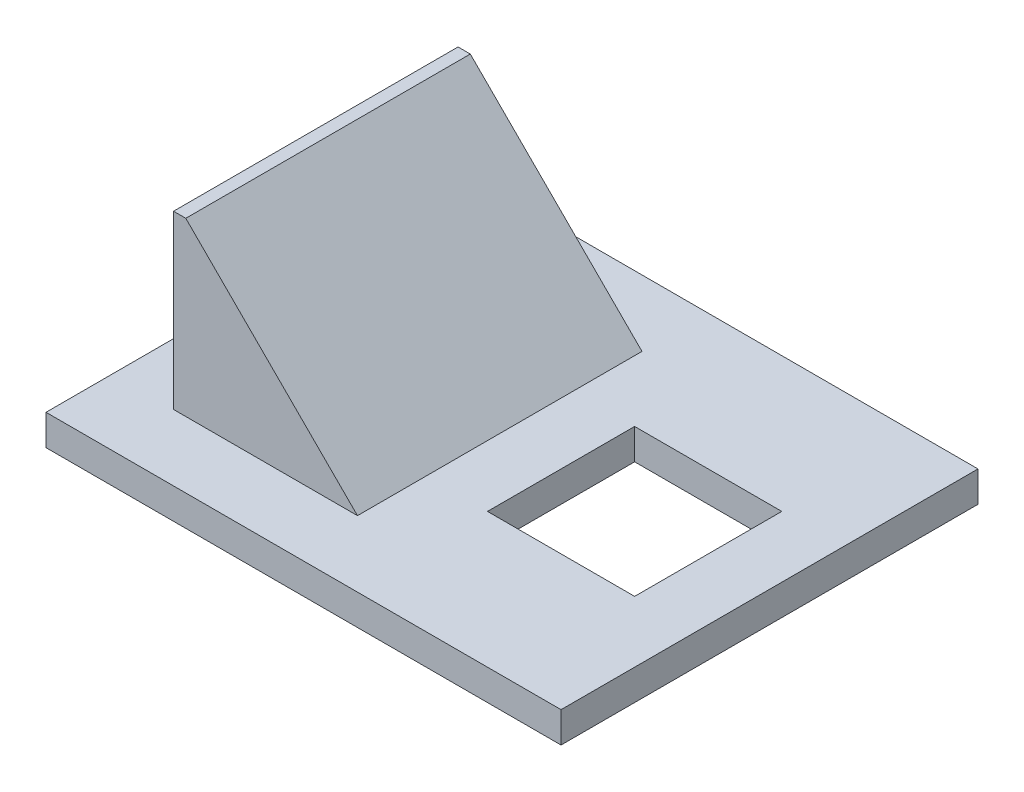
ISO-10303-21;
HEADER;
FILE_DESCRIPTION(('STEP AP214'),'2;1');
FILE_NAME('part.step','',(''),(''),'','','');
FILE_SCHEMA(('AUTOMOTIVE_DESIGN { 1 0 10303 214 1 1 1 1 }'));
ENDSEC;
DATA;
#1=APPLICATION_CONTEXT('core data for automotive mechanical design processes');
#2=APPLICATION_PROTOCOL_DEFINITION('international standard','automotive_design',2000,#1);
#3=PRODUCT_CONTEXT('',#1,'mechanical');
#4=PRODUCT('Part','Part','',(#3));
#5=PRODUCT_RELATED_PRODUCT_CATEGORY('part','',(#4));
#6=PRODUCT_DEFINITION_FORMATION('','',#4);
#7=PRODUCT_DEFINITION_CONTEXT('part definition',#1,'design');
#8=PRODUCT_DEFINITION('design','',#6,#7);
#9=PRODUCT_DEFINITION_SHAPE('','',#8);
#10=(LENGTH_UNIT() NAMED_UNIT(*) SI_UNIT(.MILLI.,.METRE.));
#11=(NAMED_UNIT(*) PLANE_ANGLE_UNIT() SI_UNIT($,.RADIAN.));
#12=(NAMED_UNIT(*) SI_UNIT($,.STERADIAN.) SOLID_ANGLE_UNIT());
#13=UNCERTAINTY_MEASURE_WITH_UNIT(LENGTH_MEASURE(1.E-05),#10,'distance_accuracy_value','');
#14=(GEOMETRIC_REPRESENTATION_CONTEXT(3) GLOBAL_UNCERTAINTY_ASSIGNED_CONTEXT((#13)) GLOBAL_UNIT_ASSIGNED_CONTEXT((#10,
#11,#12)) REPRESENTATION_CONTEXT('',''));
#15=CARTESIAN_POINT('',(0.,0.,0.));
#16=DIRECTION('',(0.,0.,1.));
#17=DIRECTION('',(1.,0.,0.));
#18=AXIS2_PLACEMENT_3D('',#15,#16,#17);
#19=CARTESIAN_POINT('',(0.,12.5,0.));
#20=DIRECTION('',(0.,1.,0.));
#21=DIRECTION('',(0.,0.,1.));
#22=AXIS2_PLACEMENT_3D('',#19,#20,#21);
#23=PLANE('',#22);
#24=DIRECTION('',(0.,0.,1.));
#25=VECTOR('',#24,1.);
#26=CARTESIAN_POINT('',(20.,12.5,-30.));
#27=LINE('',#26,#25);
#28=CARTESIAN_POINT('',(20.,12.5,-30.));
#29=VERTEX_POINT('',#28);
#30=CARTESIAN_POINT('',(20.,12.5,30.));
#31=VERTEX_POINT('',#30);
#32=EDGE_CURVE('E258',#29,#31,#27,.T.);
#33=ORIENTED_EDGE('',*,*,#32,.F.);
#34=DIRECTION('',(-1.,0.,0.));
#35=VECTOR('',#34,1.);
#36=CARTESIAN_POINT('',(20.,12.5,-30.));
#37=LINE('',#36,#35);
#38=CARTESIAN_POINT('',(80.,12.5,-30.));
#39=VERTEX_POINT('',#38);
#40=EDGE_CURVE('E267',#39,#29,#37,.T.);
#41=ORIENTED_EDGE('',*,*,#40,.F.);
#42=DIRECTION('',(0.,0.,-1.));
#43=VECTOR('',#42,1.);
#44=CARTESIAN_POINT('',(80.,12.5,-30.));
#45=LINE('',#44,#43);
#46=CARTESIAN_POINT('',(80.,12.5,30.));
#47=VERTEX_POINT('',#46);
#48=EDGE_CURVE('E264',#47,#39,#45,.T.);
#49=ORIENTED_EDGE('',*,*,#48,.F.);
#50=DIRECTION('',(1.,0.,0.));
#51=VECTOR('',#50,1.);
#52=CARTESIAN_POINT('',(20.,12.5,30.));
#53=LINE('',#52,#51);
#54=EDGE_CURVE('E260',#31,#47,#53,.T.);
#55=ORIENTED_EDGE('',*,*,#54,.F.);
#56=EDGE_LOOP('',(#33,#41,#49,#55));
#57=FACE_BOUND('',#56,.T.);
#58=DIRECTION('',(0.,0.,1.));
#59=VECTOR('',#58,1.);
#60=CARTESIAN_POINT('',(-105.,12.5,-85.));
#61=LINE('',#60,#59);
#62=CARTESIAN_POINT('',(-105.,12.5,-85.));
#63=VERTEX_POINT('',#62);
#64=CARTESIAN_POINT('',(-105.,12.5,85.));
#65=VERTEX_POINT('',#64);
#66=EDGE_CURVE('E280',#63,#65,#61,.T.);
#67=ORIENTED_EDGE('',*,*,#66,.T.);
#68=DIRECTION('',(1.,0.,0.));
#69=VECTOR('',#68,1.);
#70=CARTESIAN_POINT('',(-105.,12.5,85.));
#71=LINE('',#70,#69);
#72=CARTESIAN_POINT('',(105.,12.5,85.));
#73=VERTEX_POINT('',#72);
#74=EDGE_CURVE('E283',#65,#73,#71,.T.);
#75=ORIENTED_EDGE('',*,*,#74,.T.);
#76=DIRECTION('',(0.,0.,-1.));
#77=VECTOR('',#76,1.);
#78=CARTESIAN_POINT('',(105.,12.5,-85.));
#79=LINE('',#78,#77);
#80=CARTESIAN_POINT('',(105.,12.5,-85.));
#81=VERTEX_POINT('',#80);
#82=EDGE_CURVE('E286',#73,#81,#79,.T.);
#83=ORIENTED_EDGE('',*,*,#82,.T.);
#84=DIRECTION('',(-1.,0.,0.));
#85=VECTOR('',#84,1.);
#86=CARTESIAN_POINT('',(-105.,12.5,-85.));
#87=LINE('',#86,#85);
#88=EDGE_CURVE('E288',#81,#63,#87,.T.);
#89=ORIENTED_EDGE('',*,*,#88,.T.);
#90=EDGE_LOOP('',(#67,#75,#83,#89));
#91=FACE_BOUND('',#90,.T.);
#92=DIRECTION('',(0.,0.,-1.));
#93=VECTOR('',#92,1.);
#94=CARTESIAN_POINT('',(-4.99999999999998,12.5,-55.));
#95=LINE('',#94,#93);
#96=CARTESIAN_POINT('',(-4.99999999999998,12.5,58.));
#97=VERTEX_POINT('',#96);
#98=CARTESIAN_POINT('',(-4.99999999999998,12.5,-58.));
#99=VERTEX_POINT('',#98);
#100=EDGE_CURVE('E53',#97,#99,#95,.T.);
#101=ORIENTED_EDGE('',*,*,#100,.F.);
#102=DIRECTION('',(1.,0.,0.));
#103=VECTOR('',#102,1.);
#104=CARTESIAN_POINT('',(-80.,12.5,58.));
#105=LINE('',#104,#103);
#106=CARTESIAN_POINT('',(-80.,12.5,58.));
#107=VERTEX_POINT('',#106);
#108=EDGE_CURVE('E57',#107,#97,#105,.T.);
#109=ORIENTED_EDGE('',*,*,#108,.F.);
#110=DIRECTION('',(0.,0.,1.));
#111=VECTOR('',#110,1.);
#112=CARTESIAN_POINT('',(-80.,12.5,55.));
#113=LINE('',#112,#111);
#114=CARTESIAN_POINT('',(-80.,12.5,55.));
#115=VERTEX_POINT('',#114);
#116=EDGE_CURVE('E184',#115,#107,#113,.T.);
#117=ORIENTED_EDGE('',*,*,#116,.F.);
#118=DIRECTION('',(0.,0.,-1.));
#119=VECTOR('',#118,1.);
#120=CARTESIAN_POINT('',(-80.,12.5,0.));
#121=LINE('',#120,#119);
#122=CARTESIAN_POINT('',(-80.,12.5,-55.));
#123=VERTEX_POINT('',#122);
#124=EDGE_CURVE('E261',#115,#123,#121,.T.);
#125=ORIENTED_EDGE('',*,*,#124,.T.);
#126=DIRECTION('',(0.,0.,-1.));
#127=VECTOR('',#126,1.);
#128=CARTESIAN_POINT('',(-80.,12.5,-55.));
#129=LINE('',#128,#127);
#130=CARTESIAN_POINT('',(-80.,12.5,-58.));
#131=VERTEX_POINT('',#130);
#132=EDGE_CURVE('E214',#123,#131,#129,.T.);
#133=ORIENTED_EDGE('',*,*,#132,.T.);
#134=DIRECTION('',(-1.,0.,0.));
#135=VECTOR('',#134,1.);
#136=CARTESIAN_POINT('',(-7.49999999999998,12.5,-58.));
#137=LINE('',#136,#135);
#138=EDGE_CURVE('E208',#99,#131,#137,.T.);
#139=ORIENTED_EDGE('',*,*,#138,.F.);
#140=EDGE_LOOP('',(#101,#109,#117,#125,#133,#139));
#141=FACE_BOUND('',#140,.T.);
#142=ADVANCED_FACE('F36',(#57,#91,#141),#23,.T.);
#143=CARTESIAN_POINT('',(0.,0.,0.));
#144=DIRECTION('',(0.,1.,0.));
#145=DIRECTION('',(0.,0.,1.));
#146=AXIS2_PLACEMENT_3D('',#143,#144,#145);
#147=PLANE('',#146);
#148=DIRECTION('',(0.,0.,1.));
#149=VECTOR('',#148,1.);
#150=CARTESIAN_POINT('',(-105.,0.,-85.));
#151=LINE('',#150,#149);
#152=CARTESIAN_POINT('',(-105.,0.,-85.));
#153=VERTEX_POINT('',#152);
#154=CARTESIAN_POINT('',(-105.,0.,85.));
#155=VERTEX_POINT('',#154);
#156=EDGE_CURVE('E273',#153,#155,#151,.T.);
#157=ORIENTED_EDGE('',*,*,#156,.F.);
#158=DIRECTION('',(-1.,0.,0.));
#159=VECTOR('',#158,1.);
#160=CARTESIAN_POINT('',(-105.,0.,-85.));
#161=LINE('',#160,#159);
#162=CARTESIAN_POINT('',(105.,0.,-85.));
#163=VERTEX_POINT('',#162);
#164=EDGE_CURVE('E284',#163,#153,#161,.T.);
#165=ORIENTED_EDGE('',*,*,#164,.F.);
#166=DIRECTION('',(0.,0.,-1.));
#167=VECTOR('',#166,1.);
#168=CARTESIAN_POINT('',(105.,0.,-85.));
#169=LINE('',#168,#167);
#170=CARTESIAN_POINT('',(105.,0.,85.));
#171=VERTEX_POINT('',#170);
#172=EDGE_CURVE('E295',#171,#163,#169,.T.);
#173=ORIENTED_EDGE('',*,*,#172,.F.);
#174=DIRECTION('',(1.,0.,0.));
#175=VECTOR('',#174,1.);
#176=CARTESIAN_POINT('',(-105.,0.,85.));
#177=LINE('',#176,#175);
#178=EDGE_CURVE('E293',#155,#171,#177,.T.);
#179=ORIENTED_EDGE('',*,*,#178,.F.);
#180=EDGE_LOOP('',(#157,#165,#173,#179));
#181=FACE_BOUND('',#180,.T.);
#182=DIRECTION('',(-1.,0.,0.));
#183=VECTOR('',#182,1.);
#184=CARTESIAN_POINT('',(0.,0.,-30.));
#185=LINE('',#184,#183);
#186=CARTESIAN_POINT('',(80.,0.,-30.));
#187=VERTEX_POINT('',#186);
#188=CARTESIAN_POINT('',(20.,0.,-30.));
#189=VERTEX_POINT('',#188);
#190=EDGE_CURVE('E45',#187,#189,#185,.T.);
#191=ORIENTED_EDGE('',*,*,#190,.T.);
#192=DIRECTION('',(0.,0.,1.));
#193=VECTOR('',#192,1.);
#194=CARTESIAN_POINT('',(20.,0.,0.));
#195=LINE('',#194,#193);
#196=CARTESIAN_POINT('',(20.,0.,30.));
#197=VERTEX_POINT('',#196);
#198=EDGE_CURVE('E12',#189,#197,#195,.T.);
#199=ORIENTED_EDGE('',*,*,#198,.T.);
#200=DIRECTION('',(1.,0.,0.));
#201=VECTOR('',#200,1.);
#202=CARTESIAN_POINT('',(0.,0.,30.));
#203=LINE('',#202,#201);
#204=CARTESIAN_POINT('',(80.,0.,30.));
#205=VERTEX_POINT('',#204);
#206=EDGE_CURVE('E309',#197,#205,#203,.T.);
#207=ORIENTED_EDGE('',*,*,#206,.T.);
#208=DIRECTION('',(0.,0.,-1.));
#209=VECTOR('',#208,1.);
#210=CARTESIAN_POINT('',(80.,0.,0.));
#211=LINE('',#210,#209);
#212=EDGE_CURVE('E312',#205,#187,#211,.T.);
#213=ORIENTED_EDGE('',*,*,#212,.T.);
#214=EDGE_LOOP('',(#191,#199,#207,#213));
#215=FACE_BOUND('',#214,.T.);
#216=DIRECTION('',(0.,0.,1.));
#217=VECTOR('',#216,1.);
#218=CARTESIAN_POINT('',(-80.,0.,-55.));
#219=LINE('',#218,#217);
#220=CARTESIAN_POINT('',(-80.,0.,-55.));
#221=VERTEX_POINT('',#220);
#222=CARTESIAN_POINT('',(-80.,0.,55.));
#223=VERTEX_POINT('',#222);
#224=EDGE_CURVE('E231',#221,#223,#219,.T.);
#225=ORIENTED_EDGE('',*,*,#224,.T.);
#226=DIRECTION('',(1.,0.,0.));
#227=VECTOR('',#226,1.);
#228=CARTESIAN_POINT('',(-80.,0.,55.));
#229=LINE('',#228,#227);
#230=CARTESIAN_POINT('',(-9.99999999999998,0.,55.));
#231=VERTEX_POINT('',#230);
#232=EDGE_CURVE('E248',#223,#231,#229,.T.);
#233=ORIENTED_EDGE('',*,*,#232,.T.);
#234=DIRECTION('',(0.,0.,-1.));
#235=VECTOR('',#234,1.);
#236=CARTESIAN_POINT('',(-9.99999999999998,0.,-55.));
#237=LINE('',#236,#235);
#238=CARTESIAN_POINT('',(-9.99999999999998,0.,-55.));
#239=VERTEX_POINT('',#238);
#240=EDGE_CURVE('E251',#231,#239,#237,.T.);
#241=ORIENTED_EDGE('',*,*,#240,.T.);
#242=DIRECTION('',(-1.,0.,0.));
#243=VECTOR('',#242,1.);
#244=CARTESIAN_POINT('',(-80.,0.,-55.));
#245=LINE('',#244,#243);
#246=EDGE_CURVE('E254',#239,#221,#245,.T.);
#247=ORIENTED_EDGE('',*,*,#246,.T.);
#248=EDGE_LOOP('',(#225,#233,#241,#247));
#249=FACE_BOUND('',#248,.T.);
#250=ADVANCED_FACE('F375',(#181,#215,#249),#147,.F.);
#251=CARTESIAN_POINT('',(-105.,12.5,-85.));
#252=DIRECTION('',(1.,0.,0.));
#253=DIRECTION('',(0.,0.,-1.));
#254=AXIS2_PLACEMENT_3D('',#251,#252,#253);
#255=PLANE('',#254);
#256=ORIENTED_EDGE('',*,*,#156,.T.);
#257=DIRECTION('',(0.,-1.,0.));
#258=VECTOR('',#257,1.);
#259=CARTESIAN_POINT('',(-105.,12.5,85.));
#260=LINE('',#259,#258);
#261=EDGE_CURVE('E306',#65,#155,#260,.T.);
#262=ORIENTED_EDGE('',*,*,#261,.F.);
#263=ORIENTED_EDGE('',*,*,#66,.F.);
#264=DIRECTION('',(0.,-1.,0.));
#265=VECTOR('',#264,1.);
#266=CARTESIAN_POINT('',(-105.,12.5,-85.));
#267=LINE('',#266,#265);
#268=EDGE_CURVE('E290',#63,#153,#267,.T.);
#269=ORIENTED_EDGE('',*,*,#268,.T.);
#270=EDGE_LOOP('',(#256,#262,#263,#269));
#271=FACE_BOUND('',#270,.T.);
#272=ADVANCED_FACE('F38',(#271),#255,.F.);
#273=CARTESIAN_POINT('',(-105.,12.5,85.));
#274=DIRECTION('',(0.,0.,-1.));
#275=DIRECTION('',(-1.,0.,0.));
#276=AXIS2_PLACEMENT_3D('',#273,#274,#275);
#277=PLANE('',#276);
#278=ORIENTED_EDGE('',*,*,#178,.T.);
#279=DIRECTION('',(0.,-1.,0.));
#280=VECTOR('',#279,1.);
#281=CARTESIAN_POINT('',(105.,12.5,85.));
#282=LINE('',#281,#280);
#283=EDGE_CURVE('E303',#73,#171,#282,.T.);
#284=ORIENTED_EDGE('',*,*,#283,.F.);
#285=ORIENTED_EDGE('',*,*,#74,.F.);
#286=ORIENTED_EDGE('',*,*,#261,.T.);
#287=EDGE_LOOP('',(#278,#284,#285,#286));
#288=FACE_BOUND('',#287,.T.);
#289=ADVANCED_FACE('F395',(#288),#277,.F.);
#290=CARTESIAN_POINT('',(105.,12.5,-85.));
#291=DIRECTION('',(-1.,0.,0.));
#292=DIRECTION('',(0.,0.,1.));
#293=AXIS2_PLACEMENT_3D('',#290,#291,#292);
#294=PLANE('',#293);
#295=ORIENTED_EDGE('',*,*,#172,.T.);
#296=DIRECTION('',(0.,-1.,0.));
#297=VECTOR('',#296,1.);
#298=CARTESIAN_POINT('',(105.,12.5,-85.));
#299=LINE('',#298,#297);
#300=EDGE_CURVE('E300',#81,#163,#299,.T.);
#301=ORIENTED_EDGE('',*,*,#300,.F.);
#302=ORIENTED_EDGE('',*,*,#82,.F.);
#303=ORIENTED_EDGE('',*,*,#283,.T.);
#304=EDGE_LOOP('',(#295,#301,#302,#303));
#305=FACE_BOUND('',#304,.T.);
#306=ADVANCED_FACE('F392',(#305),#294,.F.);
#307=CARTESIAN_POINT('',(-105.,12.5,-85.));
#308=DIRECTION('',(0.,0.,1.));
#309=DIRECTION('',(1.,0.,0.));
#310=AXIS2_PLACEMENT_3D('',#307,#308,#309);
#311=PLANE('',#310);
#312=ORIENTED_EDGE('',*,*,#164,.T.);
#313=ORIENTED_EDGE('',*,*,#268,.F.);
#314=ORIENTED_EDGE('',*,*,#88,.F.);
#315=ORIENTED_EDGE('',*,*,#300,.T.);
#316=EDGE_LOOP('',(#312,#313,#314,#315));
#317=FACE_BOUND('',#316,.T.);
#318=ADVANCED_FACE('F389',(#317),#311,.F.);
#319=CARTESIAN_POINT('',(20.,-2.5,-30.));
#320=DIRECTION('',(-1.,0.,0.));
#321=DIRECTION('',(0.,0.,1.));
#322=AXIS2_PLACEMENT_3D('',#319,#320,#321);
#323=PLANE('',#322);
#324=DIRECTION('',(0.,1.,0.));
#325=VECTOR('',#324,1.);
#326=CARTESIAN_POINT('',(20.,-2.5,-30.));
#327=LINE('',#326,#325);
#328=EDGE_CURVE('E271',#189,#29,#327,.T.);
#329=ORIENTED_EDGE('',*,*,#328,.T.);
#330=ORIENTED_EDGE('',*,*,#32,.T.);
#331=DIRECTION('',(0.,1.,0.));
#332=VECTOR('',#331,1.);
#333=CARTESIAN_POINT('',(20.,-2.5,30.));
#334=LINE('',#333,#332);
#335=EDGE_CURVE('E270',#197,#31,#334,.T.);
#336=ORIENTED_EDGE('',*,*,#335,.F.);
#337=ORIENTED_EDGE('',*,*,#198,.F.);
#338=EDGE_LOOP('',(#329,#330,#336,#337));
#339=FACE_BOUND('',#338,.T.);
#340=ADVANCED_FACE('F386',(#339),#323,.F.);
#341=CARTESIAN_POINT('',(20.,-2.5,-30.));
#342=DIRECTION('',(0.,0.,-1.));
#343=DIRECTION('',(-1.,0.,0.));
#344=AXIS2_PLACEMENT_3D('',#341,#342,#343);
#345=PLANE('',#344);
#346=DIRECTION('',(0.,1.,0.));
#347=VECTOR('',#346,1.);
#348=CARTESIAN_POINT('',(80.,-2.5,-30.));
#349=LINE('',#348,#347);
#350=EDGE_CURVE('E274',#187,#39,#349,.T.);
#351=ORIENTED_EDGE('',*,*,#350,.T.);
#352=ORIENTED_EDGE('',*,*,#40,.T.);
#353=ORIENTED_EDGE('',*,*,#328,.F.);
#354=ORIENTED_EDGE('',*,*,#190,.F.);
#355=EDGE_LOOP('',(#351,#352,#353,#354));
#356=FACE_BOUND('',#355,.T.);
#357=ADVANCED_FACE('F432',(#356),#345,.F.);
#358=CARTESIAN_POINT('',(80.,-2.5,-30.));
#359=DIRECTION('',(1.,0.,0.));
#360=DIRECTION('',(0.,0.,-1.));
#361=AXIS2_PLACEMENT_3D('',#358,#359,#360);
#362=PLANE('',#361);
#363=DIRECTION('',(0.,1.,0.));
#364=VECTOR('',#363,1.);
#365=CARTESIAN_POINT('',(80.,-2.5,30.));
#366=LINE('',#365,#364);
#367=EDGE_CURVE('E276',#205,#47,#366,.T.);
#368=ORIENTED_EDGE('',*,*,#367,.T.);
#369=ORIENTED_EDGE('',*,*,#48,.T.);
#370=ORIENTED_EDGE('',*,*,#350,.F.);
#371=ORIENTED_EDGE('',*,*,#212,.F.);
#372=EDGE_LOOP('',(#368,#369,#370,#371));
#373=FACE_BOUND('',#372,.T.);
#374=ADVANCED_FACE('F435',(#373),#362,.F.);
#375=CARTESIAN_POINT('',(20.,-2.5,30.));
#376=DIRECTION('',(0.,0.,1.));
#377=DIRECTION('',(1.,0.,0.));
#378=AXIS2_PLACEMENT_3D('',#375,#376,#377);
#379=PLANE('',#378);
#380=ORIENTED_EDGE('',*,*,#335,.T.);
#381=ORIENTED_EDGE('',*,*,#54,.T.);
#382=ORIENTED_EDGE('',*,*,#367,.F.);
#383=ORIENTED_EDGE('',*,*,#206,.F.);
#384=EDGE_LOOP('',(#380,#381,#382,#383));
#385=FACE_BOUND('',#384,.T.);
#386=ADVANCED_FACE('F431',(#385),#379,.F.);
#387=CARTESIAN_POINT('',(-80.,20.,-55.));
#388=DIRECTION('',(1.,0.,0.));
#389=DIRECTION('',(0.,0.,-1.));
#390=AXIS2_PLACEMENT_3D('',#387,#388,#389);
#391=PLANE('',#390);
#392=DIRECTION('',(0.,-1.,0.));
#393=VECTOR('',#392,1.);
#394=CARTESIAN_POINT('',(-80.,20.,55.));
#395=LINE('',#394,#393);
#396=EDGE_CURVE('E324',#115,#223,#395,.T.);
#397=ORIENTED_EDGE('',*,*,#396,.T.);
#398=ORIENTED_EDGE('',*,*,#224,.F.);
#399=DIRECTION('',(0.,-1.,0.));
#400=VECTOR('',#399,1.);
#401=CARTESIAN_POINT('',(-80.,20.,-55.));
#402=LINE('',#401,#400);
#403=EDGE_CURVE('E257',#123,#221,#402,.T.);
#404=ORIENTED_EDGE('',*,*,#403,.F.);
#405=ORIENTED_EDGE('',*,*,#124,.F.);
#406=EDGE_LOOP('',(#397,#398,#404,#405));
#407=FACE_BOUND('',#406,.T.);
#408=ADVANCED_FACE('F360',(#407),#391,.T.);
#409=CARTESIAN_POINT('',(-80.,20.,55.));
#410=DIRECTION('',(0.,0.,-1.));
#411=DIRECTION('',(-1.,0.,0.));
#412=AXIS2_PLACEMENT_3D('',#409,#410,#411);
#413=PLANE('',#412);
#414=DIRECTION('',(0.,-1.,0.));
#415=VECTOR('',#414,1.);
#416=CARTESIAN_POINT('',(-9.99999999999998,20.,55.));
#417=LINE('',#416,#415);
#418=CARTESIAN_POINT('',(-9.99999999999998,12.5,55.));
#419=VERTEX_POINT('',#418);
#420=EDGE_CURVE('E319',#419,#231,#417,.T.);
#421=ORIENTED_EDGE('',*,*,#420,.T.);
#422=ORIENTED_EDGE('',*,*,#232,.F.);
#423=ORIENTED_EDGE('',*,*,#396,.F.);
#424=DIRECTION('',(0.,-1.,0.));
#425=VECTOR('',#424,1.);
#426=CARTESIAN_POINT('',(-80.,82.4999999999993,55.));
#427=LINE('',#426,#425);
#428=CARTESIAN_POINT('',(-80.,82.4999999999993,55.));
#429=VERTEX_POINT('',#428);
#430=EDGE_CURVE('E187',#429,#115,#427,.T.);
#431=ORIENTED_EDGE('',*,*,#430,.F.);
#432=DIRECTION('',(0.707106781186551,-0.707106781186544,0.));
#433=VECTOR('',#432,1.);
#434=CARTESIAN_POINT('',(-9.99999999999998,12.5,55.));
#435=LINE('',#434,#433);
#436=EDGE_CURVE('E165',#429,#419,#435,.T.);
#437=ORIENTED_EDGE('',*,*,#436,.T.);
#438=EDGE_LOOP('',(#421,#422,#423,#431,#437));
#439=FACE_BOUND('',#438,.T.);
#440=ADVANCED_FACE('F363',(#439),#413,.T.);
#441=CARTESIAN_POINT('',(-9.99999999999998,20.,-55.));
#442=DIRECTION('',(-1.,0.,0.));
#443=DIRECTION('',(0.,0.,1.));
#444=AXIS2_PLACEMENT_3D('',#441,#442,#443);
#445=PLANE('',#444);
#446=DIRECTION('',(0.,-1.,0.));
#447=VECTOR('',#446,1.);
#448=CARTESIAN_POINT('',(-9.99999999999998,20.,-55.));
#449=LINE('',#448,#447);
#450=CARTESIAN_POINT('',(-9.99999999999998,12.5,-55.));
#451=VERTEX_POINT('',#450);
#452=EDGE_CURVE('E317',#451,#239,#449,.T.);
#453=ORIENTED_EDGE('',*,*,#452,.T.);
#454=ORIENTED_EDGE('',*,*,#240,.F.);
#455=ORIENTED_EDGE('',*,*,#420,.F.);
#456=DIRECTION('',(0.,0.,1.));
#457=VECTOR('',#456,1.);
#458=CARTESIAN_POINT('',(-9.99999999999998,12.5,0.));
#459=LINE('',#458,#457);
#460=EDGE_CURVE('E322',#451,#419,#459,.T.);
#461=ORIENTED_EDGE('',*,*,#460,.F.);
#462=EDGE_LOOP('',(#453,#454,#455,#461));
#463=FACE_BOUND('',#462,.T.);
#464=ADVANCED_FACE('F418',(#463),#445,.T.);
#465=CARTESIAN_POINT('',(-80.,20.,-55.));
#466=DIRECTION('',(0.,0.,1.));
#467=DIRECTION('',(1.,0.,0.));
#468=AXIS2_PLACEMENT_3D('',#465,#466,#467);
#469=PLANE('',#468);
#470=ORIENTED_EDGE('',*,*,#403,.T.);
#471=ORIENTED_EDGE('',*,*,#246,.F.);
#472=ORIENTED_EDGE('',*,*,#452,.F.);
#473=DIRECTION('',(-0.707106781186551,0.707106781186544,0.));
#474=VECTOR('',#473,1.);
#475=CARTESIAN_POINT('',(-9.99999999999998,12.5,-55.));
#476=LINE('',#475,#474);
#477=CARTESIAN_POINT('',(-80.,82.4999999999993,-55.));
#478=VERTEX_POINT('',#477);
#479=EDGE_CURVE('E228',#451,#478,#476,.T.);
#480=ORIENTED_EDGE('',*,*,#479,.T.);
#481=DIRECTION('',(0.,1.,0.));
#482=VECTOR('',#481,1.);
#483=CARTESIAN_POINT('',(-80.,12.5,-55.));
#484=LINE('',#483,#482);
#485=EDGE_CURVE('E209',#123,#478,#484,.T.);
#486=ORIENTED_EDGE('',*,*,#485,.F.);
#487=EDGE_LOOP('',(#470,#471,#472,#480,#486));
#488=FACE_BOUND('',#487,.T.);
#489=ADVANCED_FACE('F352',(#488),#469,.T.);
#490=CARTESIAN_POINT('',(6.24999999999997,1.24999999999998,0.));
#491=DIRECTION('',(-0.707106781186545,-0.70710678118655,0.));
#492=DIRECTION('',(0.70710678118655,-0.707106781186545,0.));
#493=AXIS2_PLACEMENT_3D('',#490,#491,#492);
#494=PLANE('',#493);
#495=ORIENTED_EDGE('',*,*,#100,.T.);
#496=DIRECTION('',(0.707106781186551,-0.707106781186544,0.));
#497=VECTOR('',#496,1.);
#498=CARTESIAN_POINT('',(-75.,82.4999999999993,-58.));
#499=LINE('',#498,#497);
#500=CARTESIAN_POINT('',(-75.,82.4999999999993,-58.));
#501=VERTEX_POINT('',#500);
#502=EDGE_CURVE('E161',#501,#99,#499,.T.);
#503=ORIENTED_EDGE('',*,*,#502,.F.);
#504=DIRECTION('',(0.,0.,1.));
#505=VECTOR('',#504,1.);
#506=CARTESIAN_POINT('',(-75.,82.4999999999993,-55.));
#507=LINE('',#506,#505);
#508=CARTESIAN_POINT('',(-75.,82.4999999999993,58.));
#509=VERTEX_POINT('',#508);
#510=EDGE_CURVE('E155',#501,#509,#507,.T.);
#511=ORIENTED_EDGE('',*,*,#510,.T.);
#512=DIRECTION('',(0.707106781186551,-0.707106781186544,0.));
#513=VECTOR('',#512,1.);
#514=CARTESIAN_POINT('',(-75.,82.4999999999993,58.));
#515=LINE('',#514,#513);
#516=EDGE_CURVE('E159',#509,#97,#515,.T.);
#517=ORIENTED_EDGE('',*,*,#516,.T.);
#518=EDGE_LOOP('',(#495,#503,#511,#517));
#519=FACE_BOUND('',#518,.T.);
#520=ADVANCED_FACE('F157',(#519),#494,.F.);
#521=CARTESIAN_POINT('',(1.24999999999997,1.24999999999998,0.));
#522=DIRECTION('',(-0.707106781186545,-0.70710678118655,0.));
#523=DIRECTION('',(0.70710678118655,-0.707106781186545,0.));
#524=AXIS2_PLACEMENT_3D('',#521,#522,#523);
#525=PLANE('',#524);
#526=ORIENTED_EDGE('',*,*,#479,.F.);
#527=ORIENTED_EDGE('',*,*,#460,.T.);
#528=ORIENTED_EDGE('',*,*,#436,.F.);
#529=DIRECTION('',(0.,0.,1.));
#530=VECTOR('',#529,1.);
#531=CARTESIAN_POINT('',(-80.,82.4999999999993,-55.));
#532=LINE('',#531,#530);
#533=EDGE_CURVE('E164',#478,#429,#532,.T.);
#534=ORIENTED_EDGE('',*,*,#533,.F.);
#535=EDGE_LOOP('',(#526,#527,#528,#534));
#536=FACE_BOUND('',#535,.T.);
#537=ADVANCED_FACE('F347',(#536),#525,.T.);
#538=CARTESIAN_POINT('',(-80.,82.4999999999993,-55.));
#539=DIRECTION('',(0.,1.,0.));
#540=DIRECTION('',(0.,0.,1.));
#541=AXIS2_PLACEMENT_3D('',#538,#539,#540);
#542=PLANE('',#541);
#543=ORIENTED_EDGE('',*,*,#510,.F.);
#544=DIRECTION('',(1.,0.,0.));
#545=VECTOR('',#544,1.);
#546=CARTESIAN_POINT('',(-80.,82.4999999999993,-58.));
#547=LINE('',#546,#545);
#548=CARTESIAN_POINT('',(-80.,82.4999999999993,-58.));
#549=VERTEX_POINT('',#548);
#550=EDGE_CURVE('E177',#549,#501,#547,.T.);
#551=ORIENTED_EDGE('',*,*,#550,.F.);
#552=DIRECTION('',(0.,0.,-1.));
#553=VECTOR('',#552,1.);
#554=CARTESIAN_POINT('',(-80.,82.4999999999993,-55.));
#555=LINE('',#554,#553);
#556=EDGE_CURVE('E205',#478,#549,#555,.T.);
#557=ORIENTED_EDGE('',*,*,#556,.F.);
#558=ORIENTED_EDGE('',*,*,#533,.T.);
#559=DIRECTION('',(0.,0.,1.));
#560=VECTOR('',#559,1.);
#561=CARTESIAN_POINT('',(-80.,82.4999999999993,55.));
#562=LINE('',#561,#560);
#563=CARTESIAN_POINT('',(-80.,82.4999999999993,58.));
#564=VERTEX_POINT('',#563);
#565=EDGE_CURVE('E172',#429,#564,#562,.T.);
#566=ORIENTED_EDGE('',*,*,#565,.T.);
#567=DIRECTION('',(1.,0.,0.));
#568=VECTOR('',#567,1.);
#569=CARTESIAN_POINT('',(-80.,82.4999999999993,58.));
#570=LINE('',#569,#568);
#571=EDGE_CURVE('E169',#564,#509,#570,.T.);
#572=ORIENTED_EDGE('',*,*,#571,.T.);
#573=EDGE_LOOP('',(#543,#551,#557,#558,#566,#572));
#574=FACE_BOUND('',#573,.T.);
#575=ADVANCED_FACE('F170',(#574),#542,.T.);
#576=CARTESIAN_POINT('',(0.,0.,-58.));
#577=DIRECTION('',(0.,0.,-1.));
#578=DIRECTION('',(-1.,0.,0.));
#579=AXIS2_PLACEMENT_3D('',#576,#577,#578);
#580=PLANE('',#579);
#581=DIRECTION('',(0.,1.,0.));
#582=VECTOR('',#581,1.);
#583=CARTESIAN_POINT('',(-80.,12.5,-58.));
#584=LINE('',#583,#582);
#585=EDGE_CURVE('E199',#131,#549,#584,.T.);
#586=ORIENTED_EDGE('',*,*,#585,.T.);
#587=ORIENTED_EDGE('',*,*,#550,.T.);
#588=ORIENTED_EDGE('',*,*,#502,.T.);
#589=ORIENTED_EDGE('',*,*,#138,.T.);
#590=EDGE_LOOP('',(#586,#587,#588,#589));
#591=FACE_BOUND('',#590,.T.);
#592=ADVANCED_FACE('F341',(#591),#580,.T.);
#593=CARTESIAN_POINT('',(-80.,12.5,-55.));
#594=DIRECTION('',(-1.,0.,0.));
#595=DIRECTION('',(0.,-1.,0.));
#596=AXIS2_PLACEMENT_3D('',#593,#594,#595);
#597=PLANE('',#596);
#598=ORIENTED_EDGE('',*,*,#585,.F.);
#599=ORIENTED_EDGE('',*,*,#132,.F.);
#600=ORIENTED_EDGE('',*,*,#485,.T.);
#601=ORIENTED_EDGE('',*,*,#556,.T.);
#602=EDGE_LOOP('',(#598,#599,#600,#601));
#603=FACE_BOUND('',#602,.T.);
#604=ADVANCED_FACE('F356',(#603),#597,.T.);
#605=CARTESIAN_POINT('',(0.,0.,58.));
#606=DIRECTION('',(0.,0.,-1.));
#607=DIRECTION('',(-1.,0.,0.));
#608=AXIS2_PLACEMENT_3D('',#605,#606,#607);
#609=PLANE('',#608);
#610=ORIENTED_EDGE('',*,*,#108,.T.);
#611=ORIENTED_EDGE('',*,*,#516,.F.);
#612=ORIENTED_EDGE('',*,*,#571,.F.);
#613=DIRECTION('',(0.,-1.,0.));
#614=VECTOR('',#613,1.);
#615=CARTESIAN_POINT('',(-80.,82.4999999999993,58.));
#616=LINE('',#615,#614);
#617=EDGE_CURVE('E194',#564,#107,#616,.T.);
#618=ORIENTED_EDGE('',*,*,#617,.T.);
#619=EDGE_LOOP('',(#610,#611,#612,#618));
#620=FACE_BOUND('',#619,.T.);
#621=ADVANCED_FACE('F175',(#620),#609,.F.);
#622=CARTESIAN_POINT('',(-80.,82.4999999999993,55.));
#623=DIRECTION('',(-1.,0.,0.));
#624=DIRECTION('',(0.,0.,1.));
#625=AXIS2_PLACEMENT_3D('',#622,#623,#624);
#626=PLANE('',#625);
#627=ORIENTED_EDGE('',*,*,#617,.F.);
#628=ORIENTED_EDGE('',*,*,#565,.F.);
#629=ORIENTED_EDGE('',*,*,#430,.T.);
#630=ORIENTED_EDGE('',*,*,#116,.T.);
#631=EDGE_LOOP('',(#627,#628,#629,#630));
#632=FACE_BOUND('',#631,.T.);
#633=ADVANCED_FACE('F365',(#632),#626,.T.);
#634=CLOSED_SHELL('',(#142,#250,#272,#289,#306,#318,#340,#357,#374,#386,#408,#440,#464,#489,
#520,#537,#575,#592,#604,#621,#633));
#635=MANIFOLD_SOLID_BREP('B2',#634);
#636=ADVANCED_BREP_SHAPE_REPRESENTATION('',(#18,#635),#14);
#637=SHAPE_DEFINITION_REPRESENTATION(#9,#636);
ENDSEC;
END-ISO-10303-21;
